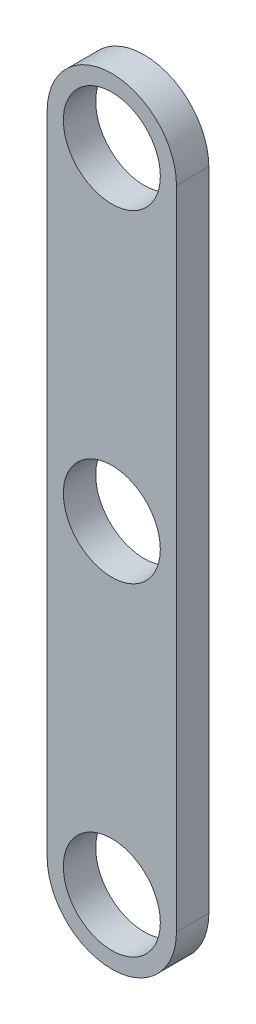
ISO-10303-21;
HEADER;
FILE_DESCRIPTION(('STEP AP214'),'2;1');
FILE_NAME('part.step','',(''),(''),'','','');
FILE_SCHEMA(('AUTOMOTIVE_DESIGN { 1 0 10303 214 1 1 1 1 }'));
ENDSEC;
DATA;
#1=APPLICATION_CONTEXT('core data for automotive mechanical design processes');
#2=APPLICATION_PROTOCOL_DEFINITION('international standard','automotive_design',2000,#1);
#3=PRODUCT_CONTEXT('',#1,'mechanical');
#4=PRODUCT('Part','Part','',(#3));
#5=PRODUCT_RELATED_PRODUCT_CATEGORY('part','',(#4));
#6=PRODUCT_DEFINITION_FORMATION('','',#4);
#7=PRODUCT_DEFINITION_CONTEXT('part definition',#1,'design');
#8=PRODUCT_DEFINITION('design','',#6,#7);
#9=PRODUCT_DEFINITION_SHAPE('','',#8);
#10=(LENGTH_UNIT() NAMED_UNIT(*) SI_UNIT(.MILLI.,.METRE.));
#11=(NAMED_UNIT(*) PLANE_ANGLE_UNIT() SI_UNIT($,.RADIAN.));
#12=(NAMED_UNIT(*) SI_UNIT($,.STERADIAN.) SOLID_ANGLE_UNIT());
#13=UNCERTAINTY_MEASURE_WITH_UNIT(LENGTH_MEASURE(1.E-05),#10,'distance_accuracy_value','');
#14=(GEOMETRIC_REPRESENTATION_CONTEXT(3) GLOBAL_UNCERTAINTY_ASSIGNED_CONTEXT((#13)) GLOBAL_UNIT_ASSIGNED_CONTEXT((#10,
#11,#12)) REPRESENTATION_CONTEXT('',''));
#15=CARTESIAN_POINT('',(0.,0.,0.));
#16=DIRECTION('',(0.,0.,1.));
#17=DIRECTION('',(1.,0.,0.));
#18=AXIS2_PLACEMENT_3D('',#15,#16,#17);
#19=CARTESIAN_POINT('',(0.,0.,5.));
#20=DIRECTION('',(0.,0.,1.));
#21=DIRECTION('',(1.,0.,0.));
#22=AXIS2_PLACEMENT_3D('',#19,#20,#21);
#23=PLANE('',#22);
#24=CARTESIAN_POINT('',(0.,0.,5.));
#25=DIRECTION('',(0.,0.,1.));
#26=DIRECTION('',(1.,0.,0.));
#27=AXIS2_PLACEMENT_3D('',#24,#25,#26);
#28=CIRCLE('',#27,7.5);
#29=CARTESIAN_POINT('',(7.5,0.,5.));
#30=VERTEX_POINT('',#29);
#31=EDGE_CURVE('E119',#30,#30,#28,.T.);
#32=ORIENTED_EDGE('',*,*,#31,.F.);
#33=EDGE_LOOP('',(#32));
#34=FACE_BOUND('',#33,.T.);
#35=CARTESIAN_POINT('',(0.,0.,5.));
#36=DIRECTION('',(0.,0.,1.));
#37=DIRECTION('',(1.,0.,0.));
#38=AXIS2_PLACEMENT_3D('',#35,#36,#37);
#39=CIRCLE('',#38,10.);
#40=CARTESIAN_POINT('',(-10.,0.,5.));
#41=VERTEX_POINT('',#40);
#42=CARTESIAN_POINT('',(10.,0.,5.));
#43=VERTEX_POINT('',#42);
#44=EDGE_CURVE('E89',#41,#43,#39,.T.);
#45=ORIENTED_EDGE('',*,*,#44,.T.);
#46=DIRECTION('',(0.,1.,0.));
#47=VECTOR('',#46,1.);
#48=CARTESIAN_POINT('',(10.,0.,5.));
#49=LINE('',#48,#47);
#50=CARTESIAN_POINT('',(10.,100.,5.));
#51=VERTEX_POINT('',#50);
#52=EDGE_CURVE('E84',#43,#51,#49,.T.);
#53=ORIENTED_EDGE('',*,*,#52,.T.);
#54=CARTESIAN_POINT('',(0.,100.,5.));
#55=DIRECTION('',(0.,0.,1.));
#56=DIRECTION('',(1.,0.,0.));
#57=AXIS2_PLACEMENT_3D('',#54,#55,#56);
#58=CIRCLE('',#57,10.);
#59=CARTESIAN_POINT('',(-10.,100.,5.));
#60=VERTEX_POINT('',#59);
#61=EDGE_CURVE('E87',#51,#60,#58,.T.);
#62=ORIENTED_EDGE('',*,*,#61,.T.);
#63=DIRECTION('',(0.,-1.,0.));
#64=VECTOR('',#63,1.);
#65=CARTESIAN_POINT('',(-10.,0.,5.));
#66=LINE('',#65,#64);
#67=EDGE_CURVE('E54',#60,#41,#66,.T.);
#68=ORIENTED_EDGE('',*,*,#67,.T.);
#69=EDGE_LOOP('',(#45,#53,#62,#68));
#70=FACE_BOUND('',#69,.T.);
#71=CARTESIAN_POINT('',(0.,100.,5.));
#72=DIRECTION('',(0.,0.,1.));
#73=DIRECTION('',(1.,0.,0.));
#74=AXIS2_PLACEMENT_3D('',#71,#72,#73);
#75=CIRCLE('',#74,7.5);
#76=CARTESIAN_POINT('',(7.5,100.,5.));
#77=VERTEX_POINT('',#76);
#78=EDGE_CURVE('E104',#77,#77,#75,.T.);
#79=ORIENTED_EDGE('',*,*,#78,.F.);
#80=EDGE_LOOP('',(#79));
#81=FACE_BOUND('',#80,.T.);
#82=CARTESIAN_POINT('',(0.,50.,5.));
#83=DIRECTION('',(0.,0.,1.));
#84=DIRECTION('',(1.,0.,0.));
#85=AXIS2_PLACEMENT_3D('',#82,#83,#84);
#86=CIRCLE('',#85,7.5);
#87=CARTESIAN_POINT('',(7.5,50.,5.));
#88=VERTEX_POINT('',#87);
#89=EDGE_CURVE('E125',#88,#88,#86,.T.);
#90=ORIENTED_EDGE('',*,*,#89,.F.);
#91=EDGE_LOOP('',(#90));
#92=FACE_BOUND('',#91,.T.);
#93=ADVANCED_FACE('F37',(#34,#70,#81,#92),#23,.T.);
#94=CARTESIAN_POINT('',(0.,0.,0.));
#95=DIRECTION('',(0.,0.,1.));
#96=DIRECTION('',(1.,0.,0.));
#97=AXIS2_PLACEMENT_3D('',#94,#95,#96);
#98=PLANE('',#97);
#99=CARTESIAN_POINT('',(0.,0.,0.));
#100=DIRECTION('',(0.,0.,1.));
#101=DIRECTION('',(1.,0.,0.));
#102=AXIS2_PLACEMENT_3D('',#99,#100,#101);
#103=CIRCLE('',#102,10.);
#104=CARTESIAN_POINT('',(-10.,0.,0.));
#105=VERTEX_POINT('',#104);
#106=CARTESIAN_POINT('',(10.,0.,0.));
#107=VERTEX_POINT('',#106);
#108=EDGE_CURVE('E101',#105,#107,#103,.T.);
#109=ORIENTED_EDGE('',*,*,#108,.F.);
#110=DIRECTION('',(0.,-1.,0.));
#111=VECTOR('',#110,1.);
#112=CARTESIAN_POINT('',(-10.,0.,0.));
#113=LINE('',#112,#111);
#114=CARTESIAN_POINT('',(-10.,100.,0.));
#115=VERTEX_POINT('',#114);
#116=EDGE_CURVE('E77',#115,#105,#113,.T.);
#117=ORIENTED_EDGE('',*,*,#116,.F.);
#118=CARTESIAN_POINT('',(0.,100.,0.));
#119=DIRECTION('',(0.,0.,1.));
#120=DIRECTION('',(1.,0.,0.));
#121=AXIS2_PLACEMENT_3D('',#118,#119,#120);
#122=CIRCLE('',#121,10.);
#123=CARTESIAN_POINT('',(10.,100.,0.));
#124=VERTEX_POINT('',#123);
#125=EDGE_CURVE('E71',#124,#115,#122,.T.);
#126=ORIENTED_EDGE('',*,*,#125,.F.);
#127=DIRECTION('',(0.,1.,0.));
#128=VECTOR('',#127,1.);
#129=CARTESIAN_POINT('',(10.,0.,0.));
#130=LINE('',#129,#128);
#131=EDGE_CURVE('E93',#107,#124,#130,.T.);
#132=ORIENTED_EDGE('',*,*,#131,.F.);
#133=EDGE_LOOP('',(#109,#117,#126,#132));
#134=FACE_BOUND('',#133,.T.);
#135=CARTESIAN_POINT('',(0.,100.,0.));
#136=DIRECTION('',(0.,0.,1.));
#137=DIRECTION('',(1.,0.,0.));
#138=AXIS2_PLACEMENT_3D('',#135,#136,#137);
#139=CIRCLE('',#138,7.5);
#140=CARTESIAN_POINT('',(7.5,100.,0.));
#141=VERTEX_POINT('',#140);
#142=EDGE_CURVE('E116',#141,#141,#139,.T.);
#143=ORIENTED_EDGE('',*,*,#142,.T.);
#144=EDGE_LOOP('',(#143));
#145=FACE_BOUND('',#144,.T.);
#146=CARTESIAN_POINT('',(0.,0.,0.));
#147=DIRECTION('',(0.,0.,1.));
#148=DIRECTION('',(1.,0.,0.));
#149=AXIS2_PLACEMENT_3D('',#146,#147,#148);
#150=CIRCLE('',#149,7.5);
#151=CARTESIAN_POINT('',(7.5,0.,0.));
#152=VERTEX_POINT('',#151);
#153=EDGE_CURVE('E122',#152,#152,#150,.T.);
#154=ORIENTED_EDGE('',*,*,#153,.T.);
#155=EDGE_LOOP('',(#154));
#156=FACE_BOUND('',#155,.T.);
#157=CARTESIAN_POINT('',(0.,50.,0.));
#158=DIRECTION('',(0.,0.,1.));
#159=DIRECTION('',(1.,0.,0.));
#160=AXIS2_PLACEMENT_3D('',#157,#158,#159);
#161=CIRCLE('',#160,7.5);
#162=CARTESIAN_POINT('',(7.5,50.,0.));
#163=VERTEX_POINT('',#162);
#164=EDGE_CURVE('E128',#163,#163,#161,.T.);
#165=ORIENTED_EDGE('',*,*,#164,.T.);
#166=EDGE_LOOP('',(#165));
#167=FACE_BOUND('',#166,.T.);
#168=ADVANCED_FACE('F112',(#134,#145,#156,#167),#98,.F.);
#169=CARTESIAN_POINT('',(0.,0.,5.));
#170=DIRECTION('',(0.,0.,-1.));
#171=DIRECTION('',(-1.,0.,0.));
#172=AXIS2_PLACEMENT_3D('',#169,#170,#171);
#173=CYLINDRICAL_SURFACE('',#172,10.);
#174=ORIENTED_EDGE('',*,*,#108,.T.);
#175=DIRECTION('',(0.,0.,-1.));
#176=VECTOR('',#175,1.);
#177=CARTESIAN_POINT('',(10.,0.,5.));
#178=LINE('',#177,#176);
#179=EDGE_CURVE('E11',#43,#107,#178,.T.);
#180=ORIENTED_EDGE('',*,*,#179,.F.);
#181=ORIENTED_EDGE('',*,*,#44,.F.);
#182=DIRECTION('',(0.,0.,-1.));
#183=VECTOR('',#182,1.);
#184=CARTESIAN_POINT('',(-10.,0.,5.));
#185=LINE('',#184,#183);
#186=EDGE_CURVE('E97',#41,#105,#185,.T.);
#187=ORIENTED_EDGE('',*,*,#186,.T.);
#188=EDGE_LOOP('',(#174,#180,#181,#187));
#189=FACE_BOUND('',#188,.T.);
#190=ADVANCED_FACE('F39',(#189),#173,.T.);
#191=CARTESIAN_POINT('',(10.,0.,5.));
#192=DIRECTION('',(-1.,0.,0.));
#193=DIRECTION('',(0.,0.,1.));
#194=AXIS2_PLACEMENT_3D('',#191,#192,#193);
#195=PLANE('',#194);
#196=ORIENTED_EDGE('',*,*,#131,.T.);
#197=DIRECTION('',(0.,0.,-1.));
#198=VECTOR('',#197,1.);
#199=CARTESIAN_POINT('',(10.,100.,5.));
#200=LINE('',#199,#198);
#201=EDGE_CURVE('E46',#51,#124,#200,.T.);
#202=ORIENTED_EDGE('',*,*,#201,.F.);
#203=ORIENTED_EDGE('',*,*,#52,.F.);
#204=ORIENTED_EDGE('',*,*,#179,.T.);
#205=EDGE_LOOP('',(#196,#202,#203,#204));
#206=FACE_BOUND('',#205,.T.);
#207=ADVANCED_FACE('F92',(#206),#195,.F.);
#208=CARTESIAN_POINT('',(0.,100.,5.));
#209=DIRECTION('',(0.,0.,-1.));
#210=DIRECTION('',(-1.,0.,0.));
#211=AXIS2_PLACEMENT_3D('',#208,#209,#210);
#212=CYLINDRICAL_SURFACE('',#211,10.);
#213=ORIENTED_EDGE('',*,*,#125,.T.);
#214=DIRECTION('',(0.,0.,-1.));
#215=VECTOR('',#214,1.);
#216=CARTESIAN_POINT('',(-10.,100.,5.));
#217=LINE('',#216,#215);
#218=EDGE_CURVE('E94',#60,#115,#217,.T.);
#219=ORIENTED_EDGE('',*,*,#218,.F.);
#220=ORIENTED_EDGE('',*,*,#61,.F.);
#221=ORIENTED_EDGE('',*,*,#201,.T.);
#222=EDGE_LOOP('',(#213,#219,#220,#221));
#223=FACE_BOUND('',#222,.T.);
#224=ADVANCED_FACE('F95',(#223),#212,.T.);
#225=CARTESIAN_POINT('',(-10.,0.,5.));
#226=DIRECTION('',(1.,0.,0.));
#227=DIRECTION('',(0.,0.,-1.));
#228=AXIS2_PLACEMENT_3D('',#225,#226,#227);
#229=PLANE('',#228);
#230=ORIENTED_EDGE('',*,*,#116,.T.);
#231=ORIENTED_EDGE('',*,*,#186,.F.);
#232=ORIENTED_EDGE('',*,*,#67,.F.);
#233=ORIENTED_EDGE('',*,*,#218,.T.);
#234=EDGE_LOOP('',(#230,#231,#232,#233));
#235=FACE_BOUND('',#234,.T.);
#236=ADVANCED_FACE('F109',(#235),#229,.F.);
#237=CARTESIAN_POINT('',(0.,100.,5.));
#238=DIRECTION('',(0.,0.,-1.));
#239=DIRECTION('',(-1.,0.,0.));
#240=AXIS2_PLACEMENT_3D('',#237,#238,#239);
#241=CYLINDRICAL_SURFACE('',#240,7.5);
#242=ORIENTED_EDGE('',*,*,#78,.T.);
#243=EDGE_LOOP('',(#242));
#244=FACE_BOUND('',#243,.T.);
#245=ORIENTED_EDGE('',*,*,#142,.F.);
#246=EDGE_LOOP('',(#245));
#247=FACE_BOUND('',#246,.T.);
#248=ADVANCED_FACE('F146',(#244,#247),#241,.F.);
#249=CARTESIAN_POINT('',(0.,0.,5.));
#250=DIRECTION('',(0.,0.,-1.));
#251=DIRECTION('',(-1.,0.,0.));
#252=AXIS2_PLACEMENT_3D('',#249,#250,#251);
#253=CYLINDRICAL_SURFACE('',#252,7.5);
#254=ORIENTED_EDGE('',*,*,#31,.T.);
#255=EDGE_LOOP('',(#254));
#256=FACE_BOUND('',#255,.T.);
#257=ORIENTED_EDGE('',*,*,#153,.F.);
#258=EDGE_LOOP('',(#257));
#259=FACE_BOUND('',#258,.T.);
#260=ADVANCED_FACE('F191',(#256,#259),#253,.F.);
#261=CARTESIAN_POINT('',(0.,50.,5.));
#262=DIRECTION('',(0.,0.,-1.));
#263=DIRECTION('',(-1.,0.,0.));
#264=AXIS2_PLACEMENT_3D('',#261,#262,#263);
#265=CYLINDRICAL_SURFACE('',#264,7.5);
#266=ORIENTED_EDGE('',*,*,#89,.T.);
#267=EDGE_LOOP('',(#266));
#268=FACE_BOUND('',#267,.T.);
#269=ORIENTED_EDGE('',*,*,#164,.F.);
#270=EDGE_LOOP('',(#269));
#271=FACE_BOUND('',#270,.T.);
#272=ADVANCED_FACE('F134',(#268,#271),#265,.F.);
#273=CLOSED_SHELL('',(#93,#168,#190,#207,#224,#236,#248,#260,#272));
#274=MANIFOLD_SOLID_BREP('B2',#273);
#275=ADVANCED_BREP_SHAPE_REPRESENTATION('',(#18,#274),#14);
#276=SHAPE_DEFINITION_REPRESENTATION(#9,#275);
ENDSEC;
END-ISO-10303-21;
